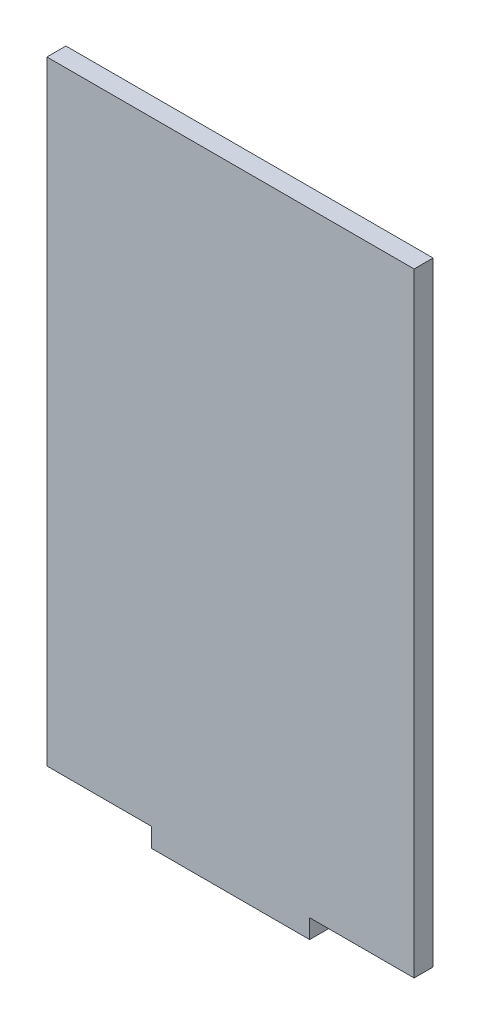
ISO-10303-21;
HEADER;
FILE_DESCRIPTION(('STEP AP214'),'2;1');
FILE_NAME('part.step','',(''),(''),'','','');
FILE_SCHEMA(('AUTOMOTIVE_DESIGN { 1 0 10303 214 1 1 1 1 }'));
ENDSEC;
DATA;
#1=APPLICATION_CONTEXT('core data for automotive mechanical design processes');
#2=APPLICATION_PROTOCOL_DEFINITION('international standard','automotive_design',2000,#1);
#3=PRODUCT_CONTEXT('',#1,'mechanical');
#4=PRODUCT('Part','Part','',(#3));
#5=PRODUCT_RELATED_PRODUCT_CATEGORY('part','',(#4));
#6=PRODUCT_DEFINITION_FORMATION('','',#4);
#7=PRODUCT_DEFINITION_CONTEXT('part definition',#1,'design');
#8=PRODUCT_DEFINITION('design','',#6,#7);
#9=PRODUCT_DEFINITION_SHAPE('','',#8);
#10=(LENGTH_UNIT() NAMED_UNIT(*) SI_UNIT(.MILLI.,.METRE.));
#11=(NAMED_UNIT(*) PLANE_ANGLE_UNIT() SI_UNIT($,.RADIAN.));
#12=(NAMED_UNIT(*) SI_UNIT($,.STERADIAN.) SOLID_ANGLE_UNIT());
#13=UNCERTAINTY_MEASURE_WITH_UNIT(LENGTH_MEASURE(1.E-05),#10,'distance_accuracy_value','');
#14=(GEOMETRIC_REPRESENTATION_CONTEXT(3) GLOBAL_UNCERTAINTY_ASSIGNED_CONTEXT((#13)) GLOBAL_UNIT_ASSIGNED_CONTEXT((#10,
#11,#12)) REPRESENTATION_CONTEXT('',''));
#15=CARTESIAN_POINT('',(0.,0.,0.));
#16=DIRECTION('',(0.,0.,1.));
#17=DIRECTION('',(1.,0.,0.));
#18=AXIS2_PLACEMENT_3D('',#15,#16,#17);
#19=CARTESIAN_POINT('',(42.,25.,6.));
#20=DIRECTION('',(0.,1.,0.));
#21=DIRECTION('',(0.,0.,1.));
#22=AXIS2_PLACEMENT_3D('',#19,#20,#21);
#23=PLANE('',#22);
#24=DIRECTION('',(1.,0.,0.));
#25=VECTOR('',#24,1.);
#26=CARTESIAN_POINT('',(42.,25.,0.));
#27=LINE('',#26,#25);
#28=CARTESIAN_POINT('',(42.,25.,0.));
#29=VERTEX_POINT('',#28);
#30=CARTESIAN_POINT('',(75.,25.,0.));
#31=VERTEX_POINT('',#30);
#32=EDGE_CURVE('E129',#29,#31,#27,.T.);
#33=ORIENTED_EDGE('',*,*,#32,.T.);
#34=DIRECTION('',(0.,0.,-1.));
#35=VECTOR('',#34,1.);
#36=CARTESIAN_POINT('',(75.,25.,6.));
#37=LINE('',#36,#35);
#38=CARTESIAN_POINT('',(75.,25.,6.));
#39=VERTEX_POINT('',#38);
#40=EDGE_CURVE('E11',#39,#31,#37,.T.);
#41=ORIENTED_EDGE('',*,*,#40,.F.);
#42=DIRECTION('',(1.,0.,0.));
#43=VECTOR('',#42,1.);
#44=CARTESIAN_POINT('',(42.,25.,6.));
#45=LINE('',#44,#43);
#46=CARTESIAN_POINT('',(42.,25.,6.));
#47=VERTEX_POINT('',#46);
#48=EDGE_CURVE('E143',#47,#39,#45,.T.);
#49=ORIENTED_EDGE('',*,*,#48,.F.);
#50=DIRECTION('',(0.,0.,-1.));
#51=VECTOR('',#50,1.);
#52=CARTESIAN_POINT('',(42.,25.,6.));
#53=LINE('',#52,#51);
#54=EDGE_CURVE('E125',#47,#29,#53,.T.);
#55=ORIENTED_EDGE('',*,*,#54,.T.);
#56=EDGE_LOOP('',(#33,#41,#49,#55));
#57=FACE_BOUND('',#56,.T.);
#58=ADVANCED_FACE('F33',(#57),#23,.F.);
#59=CARTESIAN_POINT('',(74.9999999999999,219.,6.));
#60=DIRECTION('',(-1.,0.,0.));
#61=DIRECTION('',(0.,-1.,0.));
#62=AXIS2_PLACEMENT_3D('',#59,#60,#61);
#63=PLANE('',#62);
#64=DIRECTION('',(0.,1.,0.));
#65=VECTOR('',#64,1.);
#66=CARTESIAN_POINT('',(74.9999999999999,219.,0.));
#67=LINE('',#66,#65);
#68=CARTESIAN_POINT('',(74.9999999999999,219.,0.));
#69=VERTEX_POINT('',#68);
#70=EDGE_CURVE('E132',#31,#69,#67,.T.);
#71=ORIENTED_EDGE('',*,*,#70,.T.);
#72=DIRECTION('',(0.,0.,-1.));
#73=VECTOR('',#72,1.);
#74=CARTESIAN_POINT('',(74.9999999999999,219.,6.));
#75=LINE('',#74,#73);
#76=CARTESIAN_POINT('',(74.9999999999999,219.,6.));
#77=VERTEX_POINT('',#76);
#78=EDGE_CURVE('E41',#77,#69,#75,.T.);
#79=ORIENTED_EDGE('',*,*,#78,.F.);
#80=DIRECTION('',(0.,1.,0.));
#81=VECTOR('',#80,1.);
#82=CARTESIAN_POINT('',(74.9999999999999,219.,6.));
#83=LINE('',#82,#81);
#84=EDGE_CURVE('E92',#39,#77,#83,.T.);
#85=ORIENTED_EDGE('',*,*,#84,.F.);
#86=ORIENTED_EDGE('',*,*,#40,.T.);
#87=EDGE_LOOP('',(#71,#79,#85,#86));
#88=FACE_BOUND('',#87,.T.);
#89=ADVANCED_FACE('F178',(#88),#63,.F.);
#90=CARTESIAN_POINT('',(-41.0000000000001,219.,6.));
#91=DIRECTION('',(0.,-1.,0.));
#92=DIRECTION('',(0.,0.,-1.));
#93=AXIS2_PLACEMENT_3D('',#90,#91,#92);
#94=PLANE('',#93);
#95=DIRECTION('',(-1.,0.,0.));
#96=VECTOR('',#95,1.);
#97=CARTESIAN_POINT('',(-41.0000000000001,219.,0.));
#98=LINE('',#97,#96);
#99=CARTESIAN_POINT('',(-41.0000000000001,219.,0.));
#100=VERTEX_POINT('',#99);
#101=EDGE_CURVE('E134',#69,#100,#98,.T.);
#102=ORIENTED_EDGE('',*,*,#101,.T.);
#103=DIRECTION('',(0.,0.,-1.));
#104=VECTOR('',#103,1.);
#105=CARTESIAN_POINT('',(-41.0000000000001,219.,6.));
#106=LINE('',#105,#104);
#107=CARTESIAN_POINT('',(-41.0000000000001,219.,6.));
#108=VERTEX_POINT('',#107);
#109=EDGE_CURVE('E150',#108,#100,#106,.T.);
#110=ORIENTED_EDGE('',*,*,#109,.F.);
#111=DIRECTION('',(-1.,0.,0.));
#112=VECTOR('',#111,1.);
#113=CARTESIAN_POINT('',(-41.0000000000001,219.,6.));
#114=LINE('',#113,#112);
#115=EDGE_CURVE('E158',#77,#108,#114,.T.);
#116=ORIENTED_EDGE('',*,*,#115,.F.);
#117=ORIENTED_EDGE('',*,*,#78,.T.);
#118=EDGE_LOOP('',(#102,#110,#116,#117));
#119=FACE_BOUND('',#118,.T.);
#120=ADVANCED_FACE('F156',(#119),#94,.F.);
#121=CARTESIAN_POINT('',(-41.0000000000001,219.,6.));
#122=DIRECTION('',(1.,0.,0.));
#123=DIRECTION('',(0.,1.,0.));
#124=AXIS2_PLACEMENT_3D('',#121,#122,#123);
#125=PLANE('',#124);
#126=DIRECTION('',(0.,-1.,0.));
#127=VECTOR('',#126,1.);
#128=CARTESIAN_POINT('',(-41.0000000000001,219.,0.));
#129=LINE('',#128,#127);
#130=CARTESIAN_POINT('',(-41.,25.,0.));
#131=VERTEX_POINT('',#130);
#132=EDGE_CURVE('E136',#100,#131,#129,.T.);
#133=ORIENTED_EDGE('',*,*,#132,.T.);
#134=DIRECTION('',(0.,0.,-1.));
#135=VECTOR('',#134,1.);
#136=CARTESIAN_POINT('',(-41.,25.,6.));
#137=LINE('',#136,#135);
#138=CARTESIAN_POINT('',(-41.,25.,6.));
#139=VERTEX_POINT('',#138);
#140=EDGE_CURVE('E147',#139,#131,#137,.T.);
#141=ORIENTED_EDGE('',*,*,#140,.F.);
#142=DIRECTION('',(0.,-1.,0.));
#143=VECTOR('',#142,1.);
#144=CARTESIAN_POINT('',(-41.0000000000001,219.,6.));
#145=LINE('',#144,#143);
#146=EDGE_CURVE('E170',#108,#139,#145,.T.);
#147=ORIENTED_EDGE('',*,*,#146,.F.);
#148=ORIENTED_EDGE('',*,*,#109,.T.);
#149=EDGE_LOOP('',(#133,#141,#147,#148));
#150=FACE_BOUND('',#149,.T.);
#151=ADVANCED_FACE('F166',(#150),#125,.F.);
#152=CARTESIAN_POINT('',(-41.,25.,6.));
#153=DIRECTION('',(0.,1.,0.));
#154=DIRECTION('',(0.,0.,1.));
#155=AXIS2_PLACEMENT_3D('',#152,#153,#154);
#156=PLANE('',#155);
#157=DIRECTION('',(1.,0.,0.));
#158=VECTOR('',#157,1.);
#159=CARTESIAN_POINT('',(-41.,25.,0.));
#160=LINE('',#159,#158);
#161=CARTESIAN_POINT('',(-8.00000000000002,25.,0.));
#162=VERTEX_POINT('',#161);
#163=EDGE_CURVE('E138',#131,#162,#160,.T.);
#164=ORIENTED_EDGE('',*,*,#163,.T.);
#165=DIRECTION('',(0.,0.,-1.));
#166=VECTOR('',#165,1.);
#167=CARTESIAN_POINT('',(-8.00000000000002,25.,6.));
#168=LINE('',#167,#166);
#169=CARTESIAN_POINT('',(-8.00000000000002,25.,6.));
#170=VERTEX_POINT('',#169);
#171=EDGE_CURVE('E120',#170,#162,#168,.T.);
#172=ORIENTED_EDGE('',*,*,#171,.F.);
#173=DIRECTION('',(1.,0.,0.));
#174=VECTOR('',#173,1.);
#175=CARTESIAN_POINT('',(-41.,25.,6.));
#176=LINE('',#175,#174);
#177=EDGE_CURVE('E111',#139,#170,#176,.T.);
#178=ORIENTED_EDGE('',*,*,#177,.F.);
#179=ORIENTED_EDGE('',*,*,#140,.T.);
#180=EDGE_LOOP('',(#164,#172,#178,#179));
#181=FACE_BOUND('',#180,.T.);
#182=ADVANCED_FACE('F169',(#181),#156,.F.);
#183=CARTESIAN_POINT('',(-8.00000000000002,25.,6.));
#184=DIRECTION('',(1.,0.,0.));
#185=DIRECTION('',(0.,1.,0.));
#186=AXIS2_PLACEMENT_3D('',#183,#184,#185);
#187=PLANE('',#186);
#188=DIRECTION('',(0.,-1.,0.));
#189=VECTOR('',#188,1.);
#190=CARTESIAN_POINT('',(-8.00000000000002,25.,0.));
#191=LINE('',#190,#189);
#192=CARTESIAN_POINT('',(-8.00000000000002,19.,0.));
#193=VERTEX_POINT('',#192);
#194=EDGE_CURVE('E119',#162,#193,#191,.T.);
#195=ORIENTED_EDGE('',*,*,#194,.T.);
#196=DIRECTION('',(0.,0.,-1.));
#197=VECTOR('',#196,1.);
#198=CARTESIAN_POINT('',(-8.00000000000002,19.,6.));
#199=LINE('',#198,#197);
#200=CARTESIAN_POINT('',(-8.00000000000002,19.,6.));
#201=VERTEX_POINT('',#200);
#202=EDGE_CURVE('E116',#201,#193,#199,.T.);
#203=ORIENTED_EDGE('',*,*,#202,.F.);
#204=DIRECTION('',(0.,-1.,0.));
#205=VECTOR('',#204,1.);
#206=CARTESIAN_POINT('',(-8.00000000000002,25.,6.));
#207=LINE('',#206,#205);
#208=EDGE_CURVE('E105',#170,#201,#207,.T.);
#209=ORIENTED_EDGE('',*,*,#208,.F.);
#210=ORIENTED_EDGE('',*,*,#171,.T.);
#211=EDGE_LOOP('',(#195,#203,#209,#210));
#212=FACE_BOUND('',#211,.T.);
#213=ADVANCED_FACE('F117',(#212),#187,.F.);
#214=CARTESIAN_POINT('',(-8.00000000000002,19.,6.));
#215=DIRECTION('',(0.,1.,0.));
#216=DIRECTION('',(0.,0.,1.));
#217=AXIS2_PLACEMENT_3D('',#214,#215,#216);
#218=PLANE('',#217);
#219=DIRECTION('',(1.,0.,0.));
#220=VECTOR('',#219,1.);
#221=CARTESIAN_POINT('',(-8.00000000000002,19.,0.));
#222=LINE('',#221,#220);
#223=CARTESIAN_POINT('',(42.,19.,0.));
#224=VERTEX_POINT('',#223);
#225=EDGE_CURVE('E78',#193,#224,#222,.T.);
#226=ORIENTED_EDGE('',*,*,#225,.T.);
#227=DIRECTION('',(0.,0.,-1.));
#228=VECTOR('',#227,1.);
#229=CARTESIAN_POINT('',(42.,19.,6.));
#230=LINE('',#229,#228);
#231=CARTESIAN_POINT('',(42.,19.,6.));
#232=VERTEX_POINT('',#231);
#233=EDGE_CURVE('E121',#232,#224,#230,.T.);
#234=ORIENTED_EDGE('',*,*,#233,.F.);
#235=DIRECTION('',(1.,0.,0.));
#236=VECTOR('',#235,1.);
#237=CARTESIAN_POINT('',(-8.00000000000002,19.,6.));
#238=LINE('',#237,#236);
#239=EDGE_CURVE('E109',#201,#232,#238,.T.);
#240=ORIENTED_EDGE('',*,*,#239,.F.);
#241=ORIENTED_EDGE('',*,*,#202,.T.);
#242=EDGE_LOOP('',(#226,#234,#240,#241));
#243=FACE_BOUND('',#242,.T.);
#244=ADVANCED_FACE('F123',(#243),#218,.F.);
#245=CARTESIAN_POINT('',(42.,25.,6.));
#246=DIRECTION('',(-1.,0.,0.));
#247=DIRECTION('',(0.,0.,1.));
#248=AXIS2_PLACEMENT_3D('',#245,#246,#247);
#249=PLANE('',#248);
#250=DIRECTION('',(0.,1.,0.));
#251=VECTOR('',#250,1.);
#252=CARTESIAN_POINT('',(42.,25.,0.));
#253=LINE('',#252,#251);
#254=EDGE_CURVE('E84',#224,#29,#253,.T.);
#255=ORIENTED_EDGE('',*,*,#254,.T.);
#256=ORIENTED_EDGE('',*,*,#54,.F.);
#257=DIRECTION('',(0.,1.,0.));
#258=VECTOR('',#257,1.);
#259=CARTESIAN_POINT('',(42.,25.,6.));
#260=LINE('',#259,#258);
#261=EDGE_CURVE('E49',#232,#47,#260,.T.);
#262=ORIENTED_EDGE('',*,*,#261,.F.);
#263=ORIENTED_EDGE('',*,*,#233,.T.);
#264=EDGE_LOOP('',(#255,#256,#262,#263));
#265=FACE_BOUND('',#264,.T.);
#266=ADVANCED_FACE('F194',(#265),#249,.F.);
#267=CARTESIAN_POINT('',(0.,0.,6.));
#268=DIRECTION('',(0.,0.,-1.));
#269=DIRECTION('',(-1.,0.,0.));
#270=AXIS2_PLACEMENT_3D('',#267,#268,#269);
#271=PLANE('',#270);
#272=ORIENTED_EDGE('',*,*,#48,.T.);
#273=ORIENTED_EDGE('',*,*,#84,.T.);
#274=ORIENTED_EDGE('',*,*,#115,.T.);
#275=ORIENTED_EDGE('',*,*,#146,.T.);
#276=ORIENTED_EDGE('',*,*,#177,.T.);
#277=ORIENTED_EDGE('',*,*,#208,.T.);
#278=ORIENTED_EDGE('',*,*,#239,.T.);
#279=ORIENTED_EDGE('',*,*,#261,.T.);
#280=EDGE_LOOP('',(#272,#273,#274,#275,#276,#277,#278,#279));
#281=FACE_BOUND('',#280,.T.);
#282=ADVANCED_FACE('F107',(#281),#271,.F.);
#283=CARTESIAN_POINT('',(0.,0.,0.));
#284=DIRECTION('',(0.,0.,-1.));
#285=DIRECTION('',(-1.,0.,0.));
#286=AXIS2_PLACEMENT_3D('',#283,#284,#285);
#287=PLANE('',#286);
#288=ORIENTED_EDGE('',*,*,#32,.F.);
#289=ORIENTED_EDGE('',*,*,#254,.F.);
#290=ORIENTED_EDGE('',*,*,#225,.F.);
#291=ORIENTED_EDGE('',*,*,#194,.F.);
#292=ORIENTED_EDGE('',*,*,#163,.F.);
#293=ORIENTED_EDGE('',*,*,#132,.F.);
#294=ORIENTED_EDGE('',*,*,#101,.F.);
#295=ORIENTED_EDGE('',*,*,#70,.F.);
#296=EDGE_LOOP('',(#288,#289,#290,#291,#292,#293,#294,#295));
#297=FACE_BOUND('',#296,.T.);
#298=ADVANCED_FACE('F162',(#297),#287,.T.);
#299=CLOSED_SHELL('',(#58,#89,#120,#151,#182,#213,#244,#266,#282,#298));
#300=MANIFOLD_SOLID_BREP('B2',#299);
#301=ADVANCED_BREP_SHAPE_REPRESENTATION('',(#18,#300),#14);
#302=SHAPE_DEFINITION_REPRESENTATION(#9,#301);
ENDSEC;
END-ISO-10303-21;
